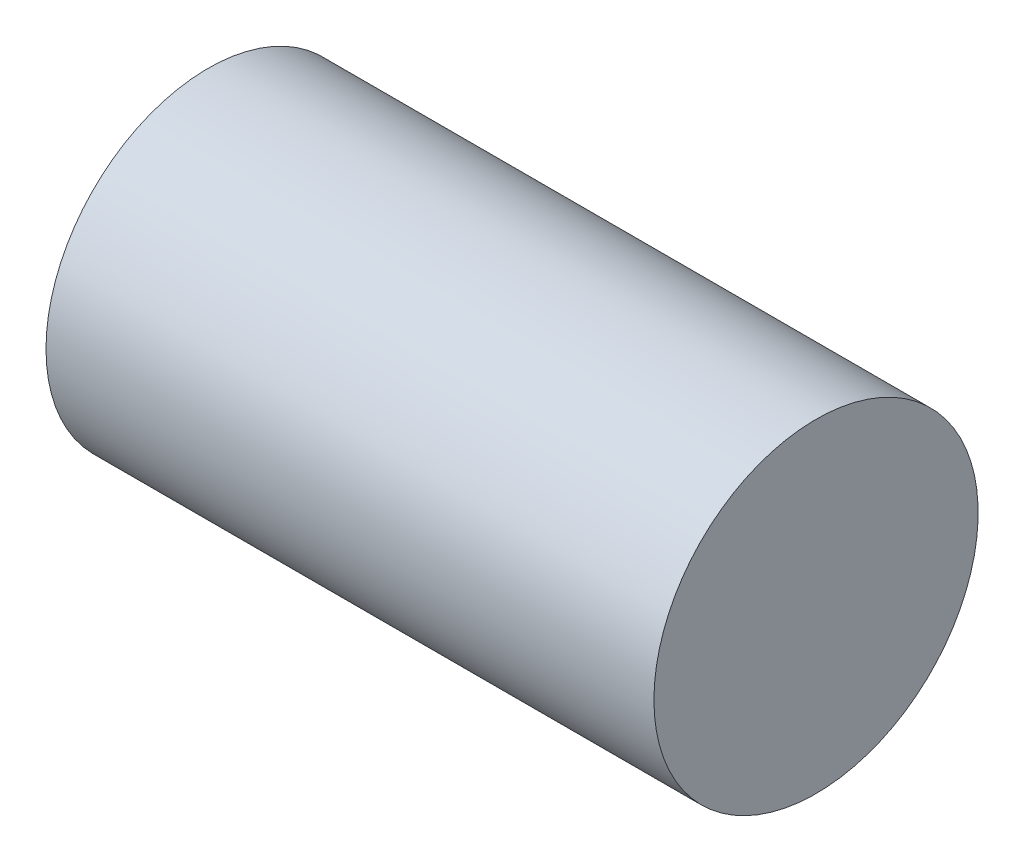
ISO-10303-21;
HEADER;
FILE_DESCRIPTION(('STEP AP214'),'2;1');
FILE_NAME('part.step','',(''),(''),'','','');
FILE_SCHEMA(('AUTOMOTIVE_DESIGN { 1 0 10303 214 1 1 1 1 }'));
ENDSEC;
DATA;
#1=APPLICATION_CONTEXT('core data for automotive mechanical design processes');
#2=APPLICATION_PROTOCOL_DEFINITION('international standard','automotive_design',2000,#1);
#3=PRODUCT_CONTEXT('',#1,'mechanical');
#4=PRODUCT('Part','Part','',(#3));
#5=PRODUCT_RELATED_PRODUCT_CATEGORY('part','',(#4));
#6=PRODUCT_DEFINITION_FORMATION('','',#4);
#7=PRODUCT_DEFINITION_CONTEXT('part definition',#1,'design');
#8=PRODUCT_DEFINITION('design','',#6,#7);
#9=PRODUCT_DEFINITION_SHAPE('','',#8);
#10=(LENGTH_UNIT() NAMED_UNIT(*) SI_UNIT(.MILLI.,.METRE.));
#11=(NAMED_UNIT(*) PLANE_ANGLE_UNIT() SI_UNIT($,.RADIAN.));
#12=(NAMED_UNIT(*) SI_UNIT($,.STERADIAN.) SOLID_ANGLE_UNIT());
#13=UNCERTAINTY_MEASURE_WITH_UNIT(LENGTH_MEASURE(1.E-05),#10,'distance_accuracy_value','');
#14=(GEOMETRIC_REPRESENTATION_CONTEXT(3) GLOBAL_UNCERTAINTY_ASSIGNED_CONTEXT((#13)) GLOBAL_UNIT_ASSIGNED_CONTEXT((#10,
#11,#12)) REPRESENTATION_CONTEXT('',''));
#15=CARTESIAN_POINT('',(0.,0.,0.));
#16=DIRECTION('',(0.,0.,1.));
#17=DIRECTION('',(1.,0.,0.));
#18=AXIS2_PLACEMENT_3D('',#15,#16,#17);
#19=CARTESIAN_POINT('',(-41.,8.,0.));
#20=DIRECTION('',(1.,0.,0.));
#21=DIRECTION('',(0.,0.,-1.));
#22=AXIS2_PLACEMENT_3D('',#19,#20,#21);
#23=PLANE('',#22);
#24=CARTESIAN_POINT('',(-41.,0.,0.));
#25=DIRECTION('',(-1.,0.,0.));
#26=DIRECTION('',(0.,0.,1.));
#27=AXIS2_PLACEMENT_3D('',#24,#25,#26);
#28=CIRCLE('',#27,8.);
#29=CARTESIAN_POINT('',(-41.,0.,8.));
#30=VERTEX_POINT('',#29);
#31=EDGE_CURVE('E42',#30,#30,#28,.T.);
#32=ORIENTED_EDGE('',*,*,#31,.T.);
#33=EDGE_LOOP('',(#32));
#34=FACE_BOUND('',#33,.T.);
#35=ADVANCED_FACE('F35',(#34),#23,.F.);
#36=CARTESIAN_POINT('',(-11.,0.,0.));
#37=DIRECTION('',(-1.,0.,0.));
#38=DIRECTION('',(0.,0.,1.));
#39=AXIS2_PLACEMENT_3D('',#36,#37,#38);
#40=PLANE('',#39);
#41=CARTESIAN_POINT('',(-11.,0.,0.));
#42=DIRECTION('',(-1.,0.,0.));
#43=DIRECTION('',(0.,0.,1.));
#44=AXIS2_PLACEMENT_3D('',#41,#42,#43);
#45=CIRCLE('',#44,8.);
#46=CARTESIAN_POINT('',(-11.,0.,8.));
#47=VERTEX_POINT('',#46);
#48=EDGE_CURVE('E10',#47,#47,#45,.T.);
#49=ORIENTED_EDGE('',*,*,#48,.F.);
#50=EDGE_LOOP('',(#49));
#51=FACE_BOUND('',#50,.T.);
#52=ADVANCED_FACE('F52',(#51),#40,.F.);
#53=CARTESIAN_POINT('',(-60.,0.,0.));
#54=DIRECTION('',(-1.,0.,0.));
#55=DIRECTION('',(0.,0.,1.));
#56=AXIS2_PLACEMENT_3D('',#53,#54,#55);
#57=CYLINDRICAL_SURFACE('',#56,8.);
#58=ORIENTED_EDGE('',*,*,#31,.F.);
#59=EDGE_LOOP('',(#58));
#60=FACE_BOUND('',#59,.T.);
#61=ORIENTED_EDGE('',*,*,#48,.T.);
#62=EDGE_LOOP('',(#61));
#63=FACE_BOUND('',#62,.T.);
#64=ADVANCED_FACE('F50',(#60,#63),#57,.T.);
#65=CLOSED_SHELL('',(#35,#52,#64));
#66=MANIFOLD_SOLID_BREP('B2',#65);
#67=ADVANCED_BREP_SHAPE_REPRESENTATION('',(#18,#66),#14);
#68=SHAPE_DEFINITION_REPRESENTATION(#9,#67);
ENDSEC;
END-ISO-10303-21;
